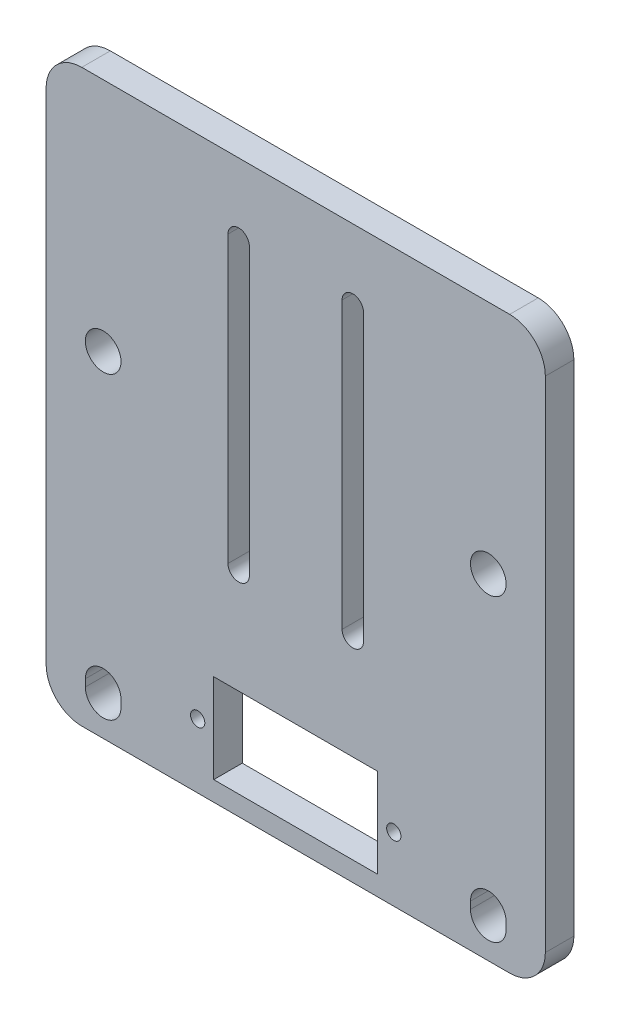
ISO-10303-21;
HEADER;
FILE_DESCRIPTION(('STEP AP214'),'2;1');
FILE_NAME('part.step','',(''),(''),'','','');
FILE_SCHEMA(('AUTOMOTIVE_DESIGN { 1 0 10303 214 1 1 1 1 }'));
ENDSEC;
DATA;
#1=APPLICATION_CONTEXT('core data for automotive mechanical design processes');
#2=APPLICATION_PROTOCOL_DEFINITION('international standard','automotive_design',2000,#1);
#3=PRODUCT_CONTEXT('',#1,'mechanical');
#4=PRODUCT('Part','Part','',(#3));
#5=PRODUCT_RELATED_PRODUCT_CATEGORY('part','',(#4));
#6=PRODUCT_DEFINITION_FORMATION('','',#4);
#7=PRODUCT_DEFINITION_CONTEXT('part definition',#1,'design');
#8=PRODUCT_DEFINITION('design','',#6,#7);
#9=PRODUCT_DEFINITION_SHAPE('','',#8);
#10=(LENGTH_UNIT() NAMED_UNIT(*) SI_UNIT(.MILLI.,.METRE.));
#11=(NAMED_UNIT(*) PLANE_ANGLE_UNIT() SI_UNIT($,.RADIAN.));
#12=(NAMED_UNIT(*) SI_UNIT($,.STERADIAN.) SOLID_ANGLE_UNIT());
#13=UNCERTAINTY_MEASURE_WITH_UNIT(LENGTH_MEASURE(1.E-05),#10,'distance_accuracy_value','');
#14=(GEOMETRIC_REPRESENTATION_CONTEXT(3) GLOBAL_UNCERTAINTY_ASSIGNED_CONTEXT((#13)) GLOBAL_UNIT_ASSIGNED_CONTEXT((#10,
#11,#12)) REPRESENTATION_CONTEXT('',''));
#15=CARTESIAN_POINT('',(0.,0.,0.));
#16=DIRECTION('',(0.,0.,1.));
#17=DIRECTION('',(1.,0.,0.));
#18=AXIS2_PLACEMENT_3D('',#15,#16,#17);
#19=CARTESIAN_POINT('',(0.,0.,4.));
#20=DIRECTION('',(0.,0.,1.));
#21=DIRECTION('',(1.,0.,0.));
#22=AXIS2_PLACEMENT_3D('',#19,#20,#21);
#23=PLANE('',#22);
#24=CARTESIAN_POINT('',(13.75,-31.,4.));
#25=DIRECTION('',(0.,0.,1.));
#26=DIRECTION('',(-1.,0.,0.));
#27=AXIS2_PLACEMENT_3D('',#24,#25,#26);
#28=CIRCLE('',#27,1.);
#29=CARTESIAN_POINT('',(12.75,-31.,4.));
#30=VERTEX_POINT('',#29);
#31=EDGE_CURVE('E247',#30,#30,#28,.T.);
#32=ORIENTED_EDGE('',*,*,#31,.F.);
#33=EDGE_LOOP('',(#32));
#34=FACE_BOUND('',#33,.T.);
#35=CARTESIAN_POINT('',(8.00000000000001,30.,4.));
#36=DIRECTION('',(0.,0.,1.));
#37=DIRECTION('',(-1.,0.,0.));
#38=AXIS2_PLACEMENT_3D('',#35,#36,#37);
#39=CIRCLE('',#38,1.49999999999999);
#40=CARTESIAN_POINT('',(9.5,30.,4.));
#41=VERTEX_POINT('',#40);
#42=CARTESIAN_POINT('',(6.50000000000002,30.,4.));
#43=VERTEX_POINT('',#42);
#44=EDGE_CURVE('E50',#41,#43,#39,.T.);
#45=ORIENTED_EDGE('',*,*,#44,.F.);
#46=DIRECTION('',(0.,1.,0.));
#47=VECTOR('',#46,1.);
#48=CARTESIAN_POINT('',(9.5,30.,4.));
#49=LINE('',#48,#47);
#50=CARTESIAN_POINT('',(9.49999999999999,-10.,4.));
#51=VERTEX_POINT('',#50);
#52=EDGE_CURVE('E269',#51,#41,#49,.T.);
#53=ORIENTED_EDGE('',*,*,#52,.F.);
#54=CARTESIAN_POINT('',(7.99999999999999,-10.,4.));
#55=DIRECTION('',(0.,0.,1.));
#56=DIRECTION('',(-1.,0.,0.));
#57=AXIS2_PLACEMENT_3D('',#54,#55,#56);
#58=CIRCLE('',#57,1.49999999999999);
#59=CARTESIAN_POINT('',(6.5,-10.,4.));
#60=VERTEX_POINT('',#59);
#61=EDGE_CURVE('E284',#60,#51,#58,.T.);
#62=ORIENTED_EDGE('',*,*,#61,.F.);
#63=DIRECTION('',(0.,-1.,0.));
#64=VECTOR('',#63,1.);
#65=CARTESIAN_POINT('',(6.50000000000002,30.,4.));
#66=LINE('',#65,#64);
#67=EDGE_CURVE('E281',#43,#60,#66,.T.);
#68=ORIENTED_EDGE('',*,*,#67,.F.);
#69=EDGE_LOOP('',(#45,#53,#62,#68));
#70=FACE_BOUND('',#69,.T.);
#71=DIRECTION('',(0.,1.,0.));
#72=VECTOR('',#71,1.);
#73=CARTESIAN_POINT('',(11.5,-24.75,4.));
#74=LINE('',#73,#72);
#75=CARTESIAN_POINT('',(11.5,-37.25,4.));
#76=VERTEX_POINT('',#75);
#77=CARTESIAN_POINT('',(11.5,-24.75,4.));
#78=VERTEX_POINT('',#77);
#79=EDGE_CURVE('E58',#76,#78,#74,.T.);
#80=ORIENTED_EDGE('',*,*,#79,.F.);
#81=DIRECTION('',(1.,0.,0.));
#82=VECTOR('',#81,1.);
#83=CARTESIAN_POINT('',(-11.5,-37.25,4.));
#84=LINE('',#83,#82);
#85=CARTESIAN_POINT('',(-11.5,-37.25,4.));
#86=VERTEX_POINT('',#85);
#87=EDGE_CURVE('E241',#86,#76,#84,.T.);
#88=ORIENTED_EDGE('',*,*,#87,.F.);
#89=DIRECTION('',(0.,-1.,0.));
#90=VECTOR('',#89,1.);
#91=CARTESIAN_POINT('',(-11.5,-24.75,4.));
#92=LINE('',#91,#90);
#93=CARTESIAN_POINT('',(-11.5,-24.75,4.));
#94=VERTEX_POINT('',#93);
#95=EDGE_CURVE('E244',#94,#86,#92,.T.);
#96=ORIENTED_EDGE('',*,*,#95,.F.);
#97=DIRECTION('',(-1.,0.,0.));
#98=VECTOR('',#97,1.);
#99=CARTESIAN_POINT('',(-11.5,-24.75,4.));
#100=LINE('',#99,#98);
#101=EDGE_CURVE('E254',#78,#94,#100,.T.);
#102=ORIENTED_EDGE('',*,*,#101,.F.);
#103=EDGE_LOOP('',(#80,#88,#96,#102));
#104=FACE_BOUND('',#103,.T.);
#105=CARTESIAN_POINT('',(-13.75,-31.,4.));
#106=DIRECTION('',(0.,0.,1.));
#107=DIRECTION('',(1.,0.,0.));
#108=AXIS2_PLACEMENT_3D('',#105,#106,#107);
#109=CIRCLE('',#108,1.);
#110=CARTESIAN_POINT('',(-12.75,-31.,4.));
#111=VERTEX_POINT('',#110);
#112=EDGE_CURVE('E261',#111,#111,#109,.T.);
#113=ORIENTED_EDGE('',*,*,#112,.F.);
#114=EDGE_LOOP('',(#113));
#115=FACE_BOUND('',#114,.T.);
#116=CARTESIAN_POINT('',(-8.00000000000001,30.,4.));
#117=DIRECTION('',(0.,0.,1.));
#118=DIRECTION('',(1.,0.,0.));
#119=AXIS2_PLACEMENT_3D('',#116,#117,#118);
#120=CIRCLE('',#119,1.49999999999999);
#121=CARTESIAN_POINT('',(-6.50000000000002,30.,4.));
#122=VERTEX_POINT('',#121);
#123=CARTESIAN_POINT('',(-9.5,30.,4.));
#124=VERTEX_POINT('',#123);
#125=EDGE_CURVE('E309',#122,#124,#120,.T.);
#126=ORIENTED_EDGE('',*,*,#125,.F.);
#127=DIRECTION('',(0.,1.,0.));
#128=VECTOR('',#127,1.);
#129=CARTESIAN_POINT('',(-6.50000000000002,30.,4.));
#130=LINE('',#129,#128);
#131=CARTESIAN_POINT('',(-6.5,-10.,4.));
#132=VERTEX_POINT('',#131);
#133=EDGE_CURVE('E299',#132,#122,#130,.T.);
#134=ORIENTED_EDGE('',*,*,#133,.F.);
#135=CARTESIAN_POINT('',(-7.99999999999999,-10.,4.));
#136=DIRECTION('',(0.,0.,1.));
#137=DIRECTION('',(1.,0.,0.));
#138=AXIS2_PLACEMENT_3D('',#135,#136,#137);
#139=CIRCLE('',#138,1.49999999999999);
#140=CARTESIAN_POINT('',(-9.49999999999999,-10.,4.));
#141=VERTEX_POINT('',#140);
#142=EDGE_CURVE('E316',#141,#132,#139,.T.);
#143=ORIENTED_EDGE('',*,*,#142,.F.);
#144=DIRECTION('',(0.,-1.,0.));
#145=VECTOR('',#144,1.);
#146=CARTESIAN_POINT('',(-9.5,30.,4.));
#147=LINE('',#146,#145);
#148=EDGE_CURVE('E312',#124,#141,#147,.T.);
#149=ORIENTED_EDGE('',*,*,#148,.F.);
#150=EDGE_LOOP('',(#126,#134,#143,#149));
#151=FACE_BOUND('',#150,.T.);
#152=DIRECTION('',(0.,-1.,0.));
#153=VECTOR('',#152,1.);
#154=CARTESIAN_POINT('',(24.5,-34.,4.));
#155=LINE('',#154,#153);
#156=CARTESIAN_POINT('',(24.5,-34.,4.));
#157=VERTEX_POINT('',#156);
#158=CARTESIAN_POINT('',(24.5,-35.,4.));
#159=VERTEX_POINT('',#158);
#160=EDGE_CURVE('E345',#157,#159,#155,.T.);
#161=ORIENTED_EDGE('',*,*,#160,.F.);
#162=CARTESIAN_POINT('',(27.,-34.,4.));
#163=DIRECTION('',(0.,0.,1.));
#164=DIRECTION('',(-1.,0.,0.));
#165=AXIS2_PLACEMENT_3D('',#162,#163,#164);
#166=CIRCLE('',#165,2.5);
#167=CARTESIAN_POINT('',(29.5,-34.,4.));
#168=VERTEX_POINT('',#167);
#169=EDGE_CURVE('E343',#168,#157,#166,.T.);
#170=ORIENTED_EDGE('',*,*,#169,.F.);
#171=DIRECTION('',(0.,1.,0.));
#172=VECTOR('',#171,1.);
#173=CARTESIAN_POINT('',(29.5,-34.,4.));
#174=LINE('',#173,#172);
#175=CARTESIAN_POINT('',(29.5,-35.,4.));
#176=VERTEX_POINT('',#175);
#177=EDGE_CURVE('E352',#176,#168,#174,.T.);
#178=ORIENTED_EDGE('',*,*,#177,.F.);
#179=CARTESIAN_POINT('',(27.,-35.,4.));
#180=DIRECTION('',(0.,0.,1.));
#181=DIRECTION('',(-1.,0.,0.));
#182=AXIS2_PLACEMENT_3D('',#179,#180,#181);
#183=CIRCLE('',#182,2.5);
#184=EDGE_CURVE('E348',#159,#176,#183,.T.);
#185=ORIENTED_EDGE('',*,*,#184,.F.);
#186=EDGE_LOOP('',(#161,#170,#178,#185));
#187=FACE_BOUND('',#186,.T.);
#188=DIRECTION('',(0.,-1.,0.));
#189=VECTOR('',#188,1.);
#190=CARTESIAN_POINT('',(-29.5,-34.,4.));
#191=LINE('',#190,#189);
#192=CARTESIAN_POINT('',(-29.5,-34.,4.));
#193=VERTEX_POINT('',#192);
#194=CARTESIAN_POINT('',(-29.5,-35.,4.));
#195=VERTEX_POINT('',#194);
#196=EDGE_CURVE('E377',#193,#195,#191,.T.);
#197=ORIENTED_EDGE('',*,*,#196,.F.);
#198=CARTESIAN_POINT('',(-27.,-34.,4.));
#199=DIRECTION('',(0.,0.,1.));
#200=DIRECTION('',(1.,0.,0.));
#201=AXIS2_PLACEMENT_3D('',#198,#199,#200);
#202=CIRCLE('',#201,2.5);
#203=CARTESIAN_POINT('',(-24.5,-34.,4.));
#204=VERTEX_POINT('',#203);
#205=EDGE_CURVE('E375',#204,#193,#202,.T.);
#206=ORIENTED_EDGE('',*,*,#205,.F.);
#207=DIRECTION('',(0.,1.,0.));
#208=VECTOR('',#207,1.);
#209=CARTESIAN_POINT('',(-24.5,-34.,4.));
#210=LINE('',#209,#208);
#211=CARTESIAN_POINT('',(-24.5,-35.,4.));
#212=VERTEX_POINT('',#211);
#213=EDGE_CURVE('E384',#212,#204,#210,.T.);
#214=ORIENTED_EDGE('',*,*,#213,.F.);
#215=CARTESIAN_POINT('',(-27.,-35.,4.));
#216=DIRECTION('',(0.,0.,1.));
#217=DIRECTION('',(1.,0.,0.));
#218=AXIS2_PLACEMENT_3D('',#215,#216,#217);
#219=CIRCLE('',#218,2.5);
#220=EDGE_CURVE('E380',#195,#212,#219,.T.);
#221=ORIENTED_EDGE('',*,*,#220,.F.);
#222=EDGE_LOOP('',(#197,#206,#214,#221));
#223=FACE_BOUND('',#222,.T.);
#224=CARTESIAN_POINT('',(-27.,7.,4.));
#225=DIRECTION('',(0.,0.,1.));
#226=DIRECTION('',(1.,0.,0.));
#227=AXIS2_PLACEMENT_3D('',#224,#225,#226);
#228=CIRCLE('',#227,2.5);
#229=CARTESIAN_POINT('',(-24.5,7.,4.));
#230=VERTEX_POINT('',#229);
#231=EDGE_CURVE('E407',#230,#230,#228,.T.);
#232=ORIENTED_EDGE('',*,*,#231,.F.);
#233=EDGE_LOOP('',(#232));
#234=FACE_BOUND('',#233,.T.);
#235=DIRECTION('',(0.,-1.,0.));
#236=VECTOR('',#235,1.);
#237=CARTESIAN_POINT('',(-35.,40.,4.));
#238=LINE('',#237,#236);
#239=CARTESIAN_POINT('',(-35.,35.,4.));
#240=VERTEX_POINT('',#239);
#241=CARTESIAN_POINT('',(-35.,-35.,4.));
#242=VERTEX_POINT('',#241);
#243=EDGE_CURVE('E421',#240,#242,#238,.T.);
#244=ORIENTED_EDGE('',*,*,#243,.T.);
#245=CARTESIAN_POINT('',(-30.,-35.,4.));
#246=DIRECTION('',(0.,0.,1.));
#247=DIRECTION('',(1.,0.,0.));
#248=AXIS2_PLACEMENT_3D('',#245,#246,#247);
#249=CIRCLE('',#248,5.);
#250=CARTESIAN_POINT('',(-30.,-40.,4.));
#251=VERTEX_POINT('',#250);
#252=EDGE_CURVE('E463',#242,#251,#249,.T.);
#253=ORIENTED_EDGE('',*,*,#252,.T.);
#254=DIRECTION('',(1.,0.,0.));
#255=VECTOR('',#254,1.);
#256=CARTESIAN_POINT('',(-35.,-40.,4.));
#257=LINE('',#256,#255);
#258=CARTESIAN_POINT('',(30.,-40.,4.));
#259=VERTEX_POINT('',#258);
#260=EDGE_CURVE('E425',#251,#259,#257,.T.);
#261=ORIENTED_EDGE('',*,*,#260,.T.);
#262=CARTESIAN_POINT('',(30.,-35.,4.));
#263=DIRECTION('',(0.,0.,1.));
#264=DIRECTION('',(1.,0.,0.));
#265=AXIS2_PLACEMENT_3D('',#262,#263,#264);
#266=CIRCLE('',#265,5.);
#267=CARTESIAN_POINT('',(35.,-35.,4.));
#268=VERTEX_POINT('',#267);
#269=EDGE_CURVE('E461',#259,#268,#266,.T.);
#270=ORIENTED_EDGE('',*,*,#269,.T.);
#271=DIRECTION('',(0.,1.,0.));
#272=VECTOR('',#271,1.);
#273=CARTESIAN_POINT('',(35.,40.,4.));
#274=LINE('',#273,#272);
#275=CARTESIAN_POINT('',(35.,35.,4.));
#276=VERTEX_POINT('',#275);
#277=EDGE_CURVE('E414',#268,#276,#274,.T.);
#278=ORIENTED_EDGE('',*,*,#277,.T.);
#279=CARTESIAN_POINT('',(30.,35.,4.));
#280=DIRECTION('',(0.,0.,1.));
#281=DIRECTION('',(1.,0.,0.));
#282=AXIS2_PLACEMENT_3D('',#279,#280,#281);
#283=CIRCLE('',#282,5.);
#284=CARTESIAN_POINT('',(30.,40.,4.));
#285=VERTEX_POINT('',#284);
#286=EDGE_CURVE('E459',#276,#285,#283,.T.);
#287=ORIENTED_EDGE('',*,*,#286,.T.);
#288=DIRECTION('',(-1.,0.,0.));
#289=VECTOR('',#288,1.);
#290=CARTESIAN_POINT('',(-35.,40.,4.));
#291=LINE('',#290,#289);
#292=CARTESIAN_POINT('',(-30.,40.,4.));
#293=VERTEX_POINT('',#292);
#294=EDGE_CURVE('E417',#285,#293,#291,.T.);
#295=ORIENTED_EDGE('',*,*,#294,.T.);
#296=CARTESIAN_POINT('',(-30.,35.,4.));
#297=DIRECTION('',(0.,0.,1.));
#298=DIRECTION('',(1.,0.,0.));
#299=AXIS2_PLACEMENT_3D('',#296,#297,#298);
#300=CIRCLE('',#299,5.);
#301=EDGE_CURVE('E457',#293,#240,#300,.T.);
#302=ORIENTED_EDGE('',*,*,#301,.T.);
#303=EDGE_LOOP('',(#244,#253,#261,#270,#278,#287,#295,#302));
#304=FACE_BOUND('',#303,.T.);
#305=CARTESIAN_POINT('',(27.,7.,4.));
#306=DIRECTION('',(0.,0.,1.));
#307=DIRECTION('',(-1.,0.,0.));
#308=AXIS2_PLACEMENT_3D('',#305,#306,#307);
#309=CIRCLE('',#308,2.5);
#310=CARTESIAN_POINT('',(24.5,7.,4.));
#311=VERTEX_POINT('',#310);
#312=EDGE_CURVE('E334',#311,#311,#309,.T.);
#313=ORIENTED_EDGE('',*,*,#312,.F.);
#314=EDGE_LOOP('',(#313));
#315=FACE_BOUND('',#314,.T.);
#316=ADVANCED_FACE('F35',(#34,#70,#104,#115,#151,#187,#223,#234,#304,#315),#23,.T.);
#317=CARTESIAN_POINT('',(0.,0.,0.));
#318=DIRECTION('',(0.,0.,1.));
#319=DIRECTION('',(1.,0.,0.));
#320=AXIS2_PLACEMENT_3D('',#317,#318,#319);
#321=PLANE('',#320);
#322=CARTESIAN_POINT('',(13.75,-31.,0.));
#323=DIRECTION('',(0.,0.,1.));
#324=DIRECTION('',(-1.,0.,0.));
#325=AXIS2_PLACEMENT_3D('',#322,#323,#324);
#326=CIRCLE('',#325,1.);
#327=CARTESIAN_POINT('',(12.75,-31.,0.));
#328=VERTEX_POINT('',#327);
#329=EDGE_CURVE('E342',#328,#328,#326,.T.);
#330=ORIENTED_EDGE('',*,*,#329,.T.);
#331=EDGE_LOOP('',(#330));
#332=FACE_BOUND('',#331,.T.);
#333=DIRECTION('',(0.,1.,0.));
#334=VECTOR('',#333,1.);
#335=CARTESIAN_POINT('',(9.5,30.,0.));
#336=LINE('',#335,#334);
#337=CARTESIAN_POINT('',(9.49999999999999,-10.,0.));
#338=VERTEX_POINT('',#337);
#339=CARTESIAN_POINT('',(9.5,30.,0.));
#340=VERTEX_POINT('',#339);
#341=EDGE_CURVE('E275',#338,#340,#336,.T.);
#342=ORIENTED_EDGE('',*,*,#341,.T.);
#343=CARTESIAN_POINT('',(8.00000000000001,30.,0.));
#344=DIRECTION('',(0.,0.,1.));
#345=DIRECTION('',(-1.,0.,0.));
#346=AXIS2_PLACEMENT_3D('',#343,#344,#345);
#347=CIRCLE('',#346,1.49999999999999);
#348=CARTESIAN_POINT('',(6.50000000000002,30.,0.));
#349=VERTEX_POINT('',#348);
#350=EDGE_CURVE('E265',#340,#349,#347,.T.);
#351=ORIENTED_EDGE('',*,*,#350,.T.);
#352=DIRECTION('',(0.,-1.,0.));
#353=VECTOR('',#352,1.);
#354=CARTESIAN_POINT('',(6.50000000000002,30.,0.));
#355=LINE('',#354,#353);
#356=CARTESIAN_POINT('',(6.5,-10.,0.));
#357=VERTEX_POINT('',#356);
#358=EDGE_CURVE('E268',#349,#357,#355,.T.);
#359=ORIENTED_EDGE('',*,*,#358,.T.);
#360=CARTESIAN_POINT('',(7.99999999999999,-10.,0.));
#361=DIRECTION('',(0.,0.,1.));
#362=DIRECTION('',(-1.,0.,0.));
#363=AXIS2_PLACEMENT_3D('',#360,#361,#362);
#364=CIRCLE('',#363,1.49999999999999);
#365=EDGE_CURVE('E272',#357,#338,#364,.T.);
#366=ORIENTED_EDGE('',*,*,#365,.T.);
#367=EDGE_LOOP('',(#342,#351,#359,#366));
#368=FACE_BOUND('',#367,.T.);
#369=DIRECTION('',(1.,0.,0.));
#370=VECTOR('',#369,1.);
#371=CARTESIAN_POINT('',(-11.5,-37.25,0.));
#372=LINE('',#371,#370);
#373=CARTESIAN_POINT('',(-11.5,-37.25,0.));
#374=VERTEX_POINT('',#373);
#375=CARTESIAN_POINT('',(11.5,-37.25,0.));
#376=VERTEX_POINT('',#375);
#377=EDGE_CURVE('E228',#374,#376,#372,.T.);
#378=ORIENTED_EDGE('',*,*,#377,.T.);
#379=DIRECTION('',(0.,1.,0.));
#380=VECTOR('',#379,1.);
#381=CARTESIAN_POINT('',(11.5,-24.75,0.));
#382=LINE('',#381,#380);
#383=CARTESIAN_POINT('',(11.5,-24.75,0.));
#384=VERTEX_POINT('',#383);
#385=EDGE_CURVE('E222',#376,#384,#382,.T.);
#386=ORIENTED_EDGE('',*,*,#385,.T.);
#387=DIRECTION('',(-1.,0.,0.));
#388=VECTOR('',#387,1.);
#389=CARTESIAN_POINT('',(-11.5,-24.75,0.));
#390=LINE('',#389,#388);
#391=CARTESIAN_POINT('',(-11.5,-24.75,0.));
#392=VERTEX_POINT('',#391);
#393=EDGE_CURVE('E232',#384,#392,#390,.T.);
#394=ORIENTED_EDGE('',*,*,#393,.T.);
#395=DIRECTION('',(0.,-1.,0.));
#396=VECTOR('',#395,1.);
#397=CARTESIAN_POINT('',(-11.5,-24.75,0.));
#398=LINE('',#397,#396);
#399=EDGE_CURVE('E236',#392,#374,#398,.T.);
#400=ORIENTED_EDGE('',*,*,#399,.T.);
#401=EDGE_LOOP('',(#378,#386,#394,#400));
#402=FACE_BOUND('',#401,.T.);
#403=CARTESIAN_POINT('',(-13.75,-31.,0.));
#404=DIRECTION('',(0.,0.,1.));
#405=DIRECTION('',(1.,0.,0.));
#406=AXIS2_PLACEMENT_3D('',#403,#404,#405);
#407=CIRCLE('',#406,1.);
#408=CARTESIAN_POINT('',(-12.75,-31.,0.));
#409=VERTEX_POINT('',#408);
#410=EDGE_CURVE('E313',#409,#409,#407,.T.);
#411=ORIENTED_EDGE('',*,*,#410,.T.);
#412=EDGE_LOOP('',(#411));
#413=FACE_BOUND('',#412,.T.);
#414=DIRECTION('',(0.,1.,0.));
#415=VECTOR('',#414,1.);
#416=CARTESIAN_POINT('',(-6.50000000000002,30.,0.));
#417=LINE('',#416,#415);
#418=CARTESIAN_POINT('',(-6.5,-10.,0.));
#419=VERTEX_POINT('',#418);
#420=CARTESIAN_POINT('',(-6.50000000000002,30.,0.));
#421=VERTEX_POINT('',#420);
#422=EDGE_CURVE('E305',#419,#421,#417,.T.);
#423=ORIENTED_EDGE('',*,*,#422,.T.);
#424=CARTESIAN_POINT('',(-8.00000000000001,30.,0.));
#425=DIRECTION('',(0.,0.,1.));
#426=DIRECTION('',(1.,0.,0.));
#427=AXIS2_PLACEMENT_3D('',#424,#425,#426);
#428=CIRCLE('',#427,1.49999999999999);
#429=CARTESIAN_POINT('',(-9.5,30.,0.));
#430=VERTEX_POINT('',#429);
#431=EDGE_CURVE('E295',#421,#430,#428,.T.);
#432=ORIENTED_EDGE('',*,*,#431,.T.);
#433=DIRECTION('',(0.,-1.,0.));
#434=VECTOR('',#433,1.);
#435=CARTESIAN_POINT('',(-9.5,30.,0.));
#436=LINE('',#435,#434);
#437=CARTESIAN_POINT('',(-9.49999999999999,-10.,0.));
#438=VERTEX_POINT('',#437);
#439=EDGE_CURVE('E298',#430,#438,#436,.T.);
#440=ORIENTED_EDGE('',*,*,#439,.T.);
#441=CARTESIAN_POINT('',(-7.99999999999999,-10.,0.));
#442=DIRECTION('',(0.,0.,1.));
#443=DIRECTION('',(1.,0.,0.));
#444=AXIS2_PLACEMENT_3D('',#441,#442,#443);
#445=CIRCLE('',#444,1.49999999999999);
#446=EDGE_CURVE('E302',#438,#419,#445,.T.);
#447=ORIENTED_EDGE('',*,*,#446,.T.);
#448=EDGE_LOOP('',(#423,#432,#440,#447));
#449=FACE_BOUND('',#448,.T.);
#450=CARTESIAN_POINT('',(-27.,-34.,0.));
#451=DIRECTION('',(0.,0.,1.));
#452=DIRECTION('',(1.,0.,0.));
#453=AXIS2_PLACEMENT_3D('',#450,#451,#452);
#454=CIRCLE('',#453,2.5);
#455=CARTESIAN_POINT('',(-24.5,-34.,0.));
#456=VERTEX_POINT('',#455);
#457=CARTESIAN_POINT('',(-29.5,-34.,0.));
#458=VERTEX_POINT('',#457);
#459=EDGE_CURVE('E374',#456,#458,#454,.T.);
#460=ORIENTED_EDGE('',*,*,#459,.T.);
#461=DIRECTION('',(0.,-1.,0.));
#462=VECTOR('',#461,1.);
#463=CARTESIAN_POINT('',(-29.5,-34.,0.));
#464=LINE('',#463,#462);
#465=CARTESIAN_POINT('',(-29.5,-35.,0.));
#466=VERTEX_POINT('',#465);
#467=EDGE_CURVE('E389',#458,#466,#464,.T.);
#468=ORIENTED_EDGE('',*,*,#467,.T.);
#469=CARTESIAN_POINT('',(-27.,-35.,0.));
#470=DIRECTION('',(0.,0.,1.));
#471=DIRECTION('',(1.,0.,0.));
#472=AXIS2_PLACEMENT_3D('',#469,#470,#471);
#473=CIRCLE('',#472,2.5);
#474=CARTESIAN_POINT('',(-24.5,-35.,0.));
#475=VERTEX_POINT('',#474);
#476=EDGE_CURVE('E392',#466,#475,#473,.T.);
#477=ORIENTED_EDGE('',*,*,#476,.T.);
#478=DIRECTION('',(0.,1.,0.));
#479=VECTOR('',#478,1.);
#480=CARTESIAN_POINT('',(-24.5,-34.,0.));
#481=LINE('',#480,#479);
#482=EDGE_CURVE('E378',#475,#456,#481,.T.);
#483=ORIENTED_EDGE('',*,*,#482,.T.);
#484=EDGE_LOOP('',(#460,#468,#477,#483));
#485=FACE_BOUND('',#484,.T.);
#486=DIRECTION('',(1.,0.,0.));
#487=VECTOR('',#486,1.);
#488=CARTESIAN_POINT('',(-35.,-40.,0.));
#489=LINE('',#488,#487);
#490=CARTESIAN_POINT('',(-30.,-40.,0.));
#491=VERTEX_POINT('',#490);
#492=CARTESIAN_POINT('',(30.,-40.,0.));
#493=VERTEX_POINT('',#492);
#494=EDGE_CURVE('E418',#491,#493,#489,.T.);
#495=ORIENTED_EDGE('',*,*,#494,.F.);
#496=CARTESIAN_POINT('',(-30.,-35.,0.));
#497=DIRECTION('',(0.,0.,1.));
#498=DIRECTION('',(1.,0.,0.));
#499=AXIS2_PLACEMENT_3D('',#496,#497,#498);
#500=CIRCLE('',#499,5.);
#501=CARTESIAN_POINT('',(-35.,-35.,0.));
#502=VERTEX_POINT('',#501);
#503=EDGE_CURVE('E450',#491,#502,#500,.F.);
#504=ORIENTED_EDGE('',*,*,#503,.T.);
#505=DIRECTION('',(0.,-1.,0.));
#506=VECTOR('',#505,1.);
#507=CARTESIAN_POINT('',(-35.,40.,0.));
#508=LINE('',#507,#506);
#509=CARTESIAN_POINT('',(-35.,35.,0.));
#510=VERTEX_POINT('',#509);
#511=EDGE_CURVE('E435',#510,#502,#508,.T.);
#512=ORIENTED_EDGE('',*,*,#511,.F.);
#513=CARTESIAN_POINT('',(-30.,35.,0.));
#514=DIRECTION('',(0.,0.,1.));
#515=DIRECTION('',(1.,0.,0.));
#516=AXIS2_PLACEMENT_3D('',#513,#514,#515);
#517=CIRCLE('',#516,5.);
#518=CARTESIAN_POINT('',(-30.,40.,0.));
#519=VERTEX_POINT('',#518);
#520=EDGE_CURVE('E444',#510,#519,#517,.F.);
#521=ORIENTED_EDGE('',*,*,#520,.T.);
#522=DIRECTION('',(-1.,0.,0.));
#523=VECTOR('',#522,1.);
#524=CARTESIAN_POINT('',(-35.,40.,0.));
#525=LINE('',#524,#523);
#526=CARTESIAN_POINT('',(30.,40.,0.));
#527=VERTEX_POINT('',#526);
#528=EDGE_CURVE('E432',#527,#519,#525,.T.);
#529=ORIENTED_EDGE('',*,*,#528,.F.);
#530=CARTESIAN_POINT('',(30.,35.,0.));
#531=DIRECTION('',(0.,0.,1.));
#532=DIRECTION('',(1.,0.,0.));
#533=AXIS2_PLACEMENT_3D('',#530,#531,#532);
#534=CIRCLE('',#533,5.);
#535=CARTESIAN_POINT('',(35.,35.,0.));
#536=VERTEX_POINT('',#535);
#537=EDGE_CURVE('E446',#527,#536,#534,.F.);
#538=ORIENTED_EDGE('',*,*,#537,.T.);
#539=DIRECTION('',(0.,1.,0.));
#540=VECTOR('',#539,1.);
#541=CARTESIAN_POINT('',(35.,40.,0.));
#542=LINE('',#541,#540);
#543=CARTESIAN_POINT('',(35.,-35.,0.));
#544=VERTEX_POINT('',#543);
#545=EDGE_CURVE('E411',#544,#536,#542,.T.);
#546=ORIENTED_EDGE('',*,*,#545,.F.);
#547=CARTESIAN_POINT('',(30.,-35.,0.));
#548=DIRECTION('',(0.,0.,1.));
#549=DIRECTION('',(1.,0.,0.));
#550=AXIS2_PLACEMENT_3D('',#547,#548,#549);
#551=CIRCLE('',#550,5.);
#552=EDGE_CURVE('E448',#544,#493,#551,.F.);
#553=ORIENTED_EDGE('',*,*,#552,.T.);
#554=EDGE_LOOP('',(#495,#504,#512,#521,#529,#538,#546,#553));
#555=FACE_BOUND('',#554,.T.);
#556=CARTESIAN_POINT('',(-27.,7.,0.));
#557=DIRECTION('',(0.,0.,1.));
#558=DIRECTION('',(1.,0.,0.));
#559=AXIS2_PLACEMENT_3D('',#556,#557,#558);
#560=CIRCLE('',#559,2.5);
#561=CARTESIAN_POINT('',(-24.5,7.,0.));
#562=VERTEX_POINT('',#561);
#563=EDGE_CURVE('E406',#562,#562,#560,.T.);
#564=ORIENTED_EDGE('',*,*,#563,.T.);
#565=EDGE_LOOP('',(#564));
#566=FACE_BOUND('',#565,.T.);
#567=CARTESIAN_POINT('',(27.,-34.,0.));
#568=DIRECTION('',(0.,0.,1.));
#569=DIRECTION('',(-1.,0.,0.));
#570=AXIS2_PLACEMENT_3D('',#567,#568,#569);
#571=CIRCLE('',#570,2.5);
#572=CARTESIAN_POINT('',(29.5,-34.,0.));
#573=VERTEX_POINT('',#572);
#574=CARTESIAN_POINT('',(24.5,-34.,0.));
#575=VERTEX_POINT('',#574);
#576=EDGE_CURVE('E338',#573,#575,#571,.T.);
#577=ORIENTED_EDGE('',*,*,#576,.T.);
#578=DIRECTION('',(0.,-1.,0.));
#579=VECTOR('',#578,1.);
#580=CARTESIAN_POINT('',(24.5,-34.,0.));
#581=LINE('',#580,#579);
#582=CARTESIAN_POINT('',(24.5,-35.,0.));
#583=VERTEX_POINT('',#582);
#584=EDGE_CURVE('E357',#575,#583,#581,.T.);
#585=ORIENTED_EDGE('',*,*,#584,.T.);
#586=CARTESIAN_POINT('',(27.,-35.,0.));
#587=DIRECTION('',(0.,0.,1.));
#588=DIRECTION('',(-1.,0.,0.));
#589=AXIS2_PLACEMENT_3D('',#586,#587,#588);
#590=CIRCLE('',#589,2.5);
#591=CARTESIAN_POINT('',(29.5,-35.,0.));
#592=VERTEX_POINT('',#591);
#593=EDGE_CURVE('E360',#583,#592,#590,.T.);
#594=ORIENTED_EDGE('',*,*,#593,.T.);
#595=DIRECTION('',(0.,1.,0.));
#596=VECTOR('',#595,1.);
#597=CARTESIAN_POINT('',(29.5,-34.,0.));
#598=LINE('',#597,#596);
#599=EDGE_CURVE('E346',#592,#573,#598,.T.);
#600=ORIENTED_EDGE('',*,*,#599,.T.);
#601=EDGE_LOOP('',(#577,#585,#594,#600));
#602=FACE_BOUND('',#601,.T.);
#603=CARTESIAN_POINT('',(27.,7.,0.));
#604=DIRECTION('',(0.,0.,1.));
#605=DIRECTION('',(-1.,0.,0.));
#606=AXIS2_PLACEMENT_3D('',#603,#604,#605);
#607=CIRCLE('',#606,2.5);
#608=CARTESIAN_POINT('',(24.5,7.,0.));
#609=VERTEX_POINT('',#608);
#610=EDGE_CURVE('E339',#609,#609,#607,.T.);
#611=ORIENTED_EDGE('',*,*,#610,.T.);
#612=EDGE_LOOP('',(#611));
#613=FACE_BOUND('',#612,.T.);
#614=ADVANCED_FACE('F238',(#332,#368,#402,#413,#449,#485,#555,#566,#602,#613),#321,.F.);
#615=CARTESIAN_POINT('',(35.,40.,4.));
#616=DIRECTION('',(-1.,0.,0.));
#617=DIRECTION('',(0.,-1.,0.));
#618=AXIS2_PLACEMENT_3D('',#615,#616,#617);
#619=PLANE('',#618);
#620=ORIENTED_EDGE('',*,*,#277,.F.);
#621=DIRECTION('',(0.,0.,-1.));
#622=VECTOR('',#621,1.);
#623=CARTESIAN_POINT('',(35.,-35.,4.));
#624=LINE('',#623,#622);
#625=EDGE_CURVE('E467',#268,#544,#624,.T.);
#626=ORIENTED_EDGE('',*,*,#625,.T.);
#627=ORIENTED_EDGE('',*,*,#545,.T.);
#628=DIRECTION('',(0.,0.,-1.));
#629=VECTOR('',#628,1.);
#630=CARTESIAN_POINT('',(35.,35.,4.));
#631=LINE('',#630,#629);
#632=EDGE_CURVE('E465',#536,#276,#631,.F.);
#633=ORIENTED_EDGE('',*,*,#632,.T.);
#634=EDGE_LOOP('',(#620,#626,#627,#633));
#635=FACE_BOUND('',#634,.T.);
#636=ADVANCED_FACE('F504',(#635),#619,.F.);
#637=CARTESIAN_POINT('',(-35.,40.,4.));
#638=DIRECTION('',(0.,-1.,0.));
#639=DIRECTION('',(0.,0.,-1.));
#640=AXIS2_PLACEMENT_3D('',#637,#638,#639);
#641=PLANE('',#640);
#642=ORIENTED_EDGE('',*,*,#294,.F.);
#643=DIRECTION('',(0.,0.,-1.));
#644=VECTOR('',#643,1.);
#645=CARTESIAN_POINT('',(30.,40.,4.));
#646=LINE('',#645,#644);
#647=EDGE_CURVE('E11',#285,#527,#646,.T.);
#648=ORIENTED_EDGE('',*,*,#647,.T.);
#649=ORIENTED_EDGE('',*,*,#528,.T.);
#650=DIRECTION('',(0.,0.,-1.));
#651=VECTOR('',#650,1.);
#652=CARTESIAN_POINT('',(-30.,40.,4.));
#653=LINE('',#652,#651);
#654=EDGE_CURVE('E43',#519,#293,#653,.F.);
#655=ORIENTED_EDGE('',*,*,#654,.T.);
#656=EDGE_LOOP('',(#642,#648,#649,#655));
#657=FACE_BOUND('',#656,.T.);
#658=ADVANCED_FACE('F472',(#657),#641,.F.);
#659=CARTESIAN_POINT('',(-35.,40.,4.));
#660=DIRECTION('',(1.,0.,0.));
#661=DIRECTION('',(0.,0.,-1.));
#662=AXIS2_PLACEMENT_3D('',#659,#660,#661);
#663=PLANE('',#662);
#664=ORIENTED_EDGE('',*,*,#511,.T.);
#665=DIRECTION('',(0.,0.,-1.));
#666=VECTOR('',#665,1.);
#667=CARTESIAN_POINT('',(-35.,-35.,4.));
#668=LINE('',#667,#666);
#669=EDGE_CURVE('E455',#502,#242,#668,.F.);
#670=ORIENTED_EDGE('',*,*,#669,.T.);
#671=ORIENTED_EDGE('',*,*,#243,.F.);
#672=DIRECTION('',(0.,0.,-1.));
#673=VECTOR('',#672,1.);
#674=CARTESIAN_POINT('',(-35.,35.,4.));
#675=LINE('',#674,#673);
#676=EDGE_CURVE('E452',#240,#510,#675,.T.);
#677=ORIENTED_EDGE('',*,*,#676,.T.);
#678=EDGE_LOOP('',(#664,#670,#671,#677));
#679=FACE_BOUND('',#678,.T.);
#680=ADVANCED_FACE('F484',(#679),#663,.F.);
#681=CARTESIAN_POINT('',(-35.,-40.,4.));
#682=DIRECTION('',(0.,1.,0.));
#683=DIRECTION('',(0.,0.,1.));
#684=AXIS2_PLACEMENT_3D('',#681,#682,#683);
#685=PLANE('',#684);
#686=ORIENTED_EDGE('',*,*,#260,.F.);
#687=DIRECTION('',(0.,0.,-1.));
#688=VECTOR('',#687,1.);
#689=CARTESIAN_POINT('',(-30.,-40.,4.));
#690=LINE('',#689,#688);
#691=EDGE_CURVE('E441',#251,#491,#690,.T.);
#692=ORIENTED_EDGE('',*,*,#691,.T.);
#693=ORIENTED_EDGE('',*,*,#494,.T.);
#694=DIRECTION('',(0.,0.,-1.));
#695=VECTOR('',#694,1.);
#696=CARTESIAN_POINT('',(30.,-40.,4.));
#697=LINE('',#696,#695);
#698=EDGE_CURVE('E429',#493,#259,#697,.F.);
#699=ORIENTED_EDGE('',*,*,#698,.T.);
#700=EDGE_LOOP('',(#686,#692,#693,#699));
#701=FACE_BOUND('',#700,.T.);
#702=ADVANCED_FACE('F495',(#701),#685,.F.);
#703=CARTESIAN_POINT('',(-27.,7.,4.));
#704=DIRECTION('',(0.,0.,-1.));
#705=DIRECTION('',(-1.,0.,0.));
#706=AXIS2_PLACEMENT_3D('',#703,#704,#705);
#707=CYLINDRICAL_SURFACE('',#706,2.5);
#708=ORIENTED_EDGE('',*,*,#231,.T.);
#709=EDGE_LOOP('',(#708));
#710=FACE_BOUND('',#709,.T.);
#711=ORIENTED_EDGE('',*,*,#563,.F.);
#712=EDGE_LOOP('',(#711));
#713=FACE_BOUND('',#712,.T.);
#714=ADVANCED_FACE('F526',(#710,#713),#707,.F.);
#715=CARTESIAN_POINT('',(-27.,-34.,4.));
#716=DIRECTION('',(0.,0.,-1.));
#717=DIRECTION('',(-1.,0.,0.));
#718=AXIS2_PLACEMENT_3D('',#715,#716,#717);
#719=CYLINDRICAL_SURFACE('',#718,2.5);
#720=ORIENTED_EDGE('',*,*,#459,.F.);
#721=DIRECTION('',(0.,0.,-1.));
#722=VECTOR('',#721,1.);
#723=CARTESIAN_POINT('',(-24.5,-34.,4.));
#724=LINE('',#723,#722);
#725=EDGE_CURVE('E386',#204,#456,#724,.T.);
#726=ORIENTED_EDGE('',*,*,#725,.F.);
#727=ORIENTED_EDGE('',*,*,#205,.T.);
#728=DIRECTION('',(0.,0.,-1.));
#729=VECTOR('',#728,1.);
#730=CARTESIAN_POINT('',(-29.5,-34.,4.));
#731=LINE('',#730,#729);
#732=EDGE_CURVE('E403',#193,#458,#731,.T.);
#733=ORIENTED_EDGE('',*,*,#732,.T.);
#734=EDGE_LOOP('',(#720,#726,#727,#733));
#735=FACE_BOUND('',#734,.T.);
#736=ADVANCED_FACE('F577',(#735),#719,.F.);
#737=CARTESIAN_POINT('',(-29.5,-34.,4.));
#738=DIRECTION('',(1.,0.,0.));
#739=DIRECTION('',(0.,0.,-1.));
#740=AXIS2_PLACEMENT_3D('',#737,#738,#739);
#741=PLANE('',#740);
#742=ORIENTED_EDGE('',*,*,#467,.F.);
#743=ORIENTED_EDGE('',*,*,#732,.F.);
#744=ORIENTED_EDGE('',*,*,#196,.T.);
#745=DIRECTION('',(0.,0.,-1.));
#746=VECTOR('',#745,1.);
#747=CARTESIAN_POINT('',(-29.5,-35.,4.));
#748=LINE('',#747,#746);
#749=EDGE_CURVE('E401',#195,#466,#748,.T.);
#750=ORIENTED_EDGE('',*,*,#749,.T.);
#751=EDGE_LOOP('',(#742,#743,#744,#750));
#752=FACE_BOUND('',#751,.T.);
#753=ADVANCED_FACE('F574',(#752),#741,.T.);
#754=CARTESIAN_POINT('',(-27.,-35.,4.));
#755=DIRECTION('',(0.,0.,-1.));
#756=DIRECTION('',(-1.,0.,0.));
#757=AXIS2_PLACEMENT_3D('',#754,#755,#756);
#758=CYLINDRICAL_SURFACE('',#757,2.5);
#759=ORIENTED_EDGE('',*,*,#476,.F.);
#760=ORIENTED_EDGE('',*,*,#749,.F.);
#761=ORIENTED_EDGE('',*,*,#220,.T.);
#762=DIRECTION('',(0.,0.,-1.));
#763=VECTOR('',#762,1.);
#764=CARTESIAN_POINT('',(-24.5,-35.,4.));
#765=LINE('',#764,#763);
#766=EDGE_CURVE('E399',#212,#475,#765,.T.);
#767=ORIENTED_EDGE('',*,*,#766,.T.);
#768=EDGE_LOOP('',(#759,#760,#761,#767));
#769=FACE_BOUND('',#768,.T.);
#770=ADVANCED_FACE('F570',(#769),#758,.F.);
#771=CARTESIAN_POINT('',(-24.5,-34.,4.));
#772=DIRECTION('',(-1.,0.,0.));
#773=DIRECTION('',(0.,0.,1.));
#774=AXIS2_PLACEMENT_3D('',#771,#772,#773);
#775=PLANE('',#774);
#776=ORIENTED_EDGE('',*,*,#482,.F.);
#777=ORIENTED_EDGE('',*,*,#766,.F.);
#778=ORIENTED_EDGE('',*,*,#213,.T.);
#779=ORIENTED_EDGE('',*,*,#725,.T.);
#780=EDGE_LOOP('',(#776,#777,#778,#779));
#781=FACE_BOUND('',#780,.T.);
#782=ADVANCED_FACE('F566',(#781),#775,.T.);
#783=CARTESIAN_POINT('',(27.,-34.,4.));
#784=DIRECTION('',(0.,0.,-1.));
#785=DIRECTION('',(-1.,0.,0.));
#786=AXIS2_PLACEMENT_3D('',#783,#784,#785);
#787=CYLINDRICAL_SURFACE('',#786,2.5);
#788=ORIENTED_EDGE('',*,*,#576,.F.);
#789=DIRECTION('',(0.,0.,-1.));
#790=VECTOR('',#789,1.);
#791=CARTESIAN_POINT('',(29.5,-34.,4.));
#792=LINE('',#791,#790);
#793=EDGE_CURVE('E354',#168,#573,#792,.T.);
#794=ORIENTED_EDGE('',*,*,#793,.F.);
#795=ORIENTED_EDGE('',*,*,#169,.T.);
#796=DIRECTION('',(0.,0.,-1.));
#797=VECTOR('',#796,1.);
#798=CARTESIAN_POINT('',(24.5,-34.,4.));
#799=LINE('',#798,#797);
#800=EDGE_CURVE('E371',#157,#575,#799,.T.);
#801=ORIENTED_EDGE('',*,*,#800,.T.);
#802=EDGE_LOOP('',(#788,#794,#795,#801));
#803=FACE_BOUND('',#802,.T.);
#804=ADVANCED_FACE('F562',(#803),#787,.F.);
#805=CARTESIAN_POINT('',(24.5,-34.,4.));
#806=DIRECTION('',(1.,0.,0.));
#807=DIRECTION('',(0.,0.,-1.));
#808=AXIS2_PLACEMENT_3D('',#805,#806,#807);
#809=PLANE('',#808);
#810=ORIENTED_EDGE('',*,*,#584,.F.);
#811=ORIENTED_EDGE('',*,*,#800,.F.);
#812=ORIENTED_EDGE('',*,*,#160,.T.);
#813=DIRECTION('',(0.,0.,-1.));
#814=VECTOR('',#813,1.);
#815=CARTESIAN_POINT('',(24.5,-35.,4.));
#816=LINE('',#815,#814);
#817=EDGE_CURVE('E369',#159,#583,#816,.T.);
#818=ORIENTED_EDGE('',*,*,#817,.T.);
#819=EDGE_LOOP('',(#810,#811,#812,#818));
#820=FACE_BOUND('',#819,.T.);
#821=ADVANCED_FACE('F558',(#820),#809,.T.);
#822=CARTESIAN_POINT('',(27.,-35.,4.));
#823=DIRECTION('',(0.,0.,-1.));
#824=DIRECTION('',(-1.,0.,0.));
#825=AXIS2_PLACEMENT_3D('',#822,#823,#824);
#826=CYLINDRICAL_SURFACE('',#825,2.5);
#827=ORIENTED_EDGE('',*,*,#593,.F.);
#828=ORIENTED_EDGE('',*,*,#817,.F.);
#829=ORIENTED_EDGE('',*,*,#184,.T.);
#830=DIRECTION('',(0.,0.,-1.));
#831=VECTOR('',#830,1.);
#832=CARTESIAN_POINT('',(29.5,-35.,4.));
#833=LINE('',#832,#831);
#834=EDGE_CURVE('E367',#176,#592,#833,.T.);
#835=ORIENTED_EDGE('',*,*,#834,.T.);
#836=EDGE_LOOP('',(#827,#828,#829,#835));
#837=FACE_BOUND('',#836,.T.);
#838=ADVANCED_FACE('F548',(#837),#826,.F.);
#839=CARTESIAN_POINT('',(29.5,-34.,4.));
#840=DIRECTION('',(-1.,0.,0.));
#841=DIRECTION('',(0.,0.,1.));
#842=AXIS2_PLACEMENT_3D('',#839,#840,#841);
#843=PLANE('',#842);
#844=ORIENTED_EDGE('',*,*,#599,.F.);
#845=ORIENTED_EDGE('',*,*,#834,.F.);
#846=ORIENTED_EDGE('',*,*,#177,.T.);
#847=ORIENTED_EDGE('',*,*,#793,.T.);
#848=EDGE_LOOP('',(#844,#845,#846,#847));
#849=FACE_BOUND('',#848,.T.);
#850=ADVANCED_FACE('F542',(#849),#843,.T.);
#851=CARTESIAN_POINT('',(27.,7.,4.));
#852=DIRECTION('',(0.,0.,-1.));
#853=DIRECTION('',(-1.,0.,0.));
#854=AXIS2_PLACEMENT_3D('',#851,#852,#853);
#855=CYLINDRICAL_SURFACE('',#854,2.5);
#856=ORIENTED_EDGE('',*,*,#312,.T.);
#857=EDGE_LOOP('',(#856));
#858=FACE_BOUND('',#857,.T.);
#859=ORIENTED_EDGE('',*,*,#610,.F.);
#860=EDGE_LOOP('',(#859));
#861=FACE_BOUND('',#860,.T.);
#862=ADVANCED_FACE('F538',(#858,#861),#855,.F.);
#863=CARTESIAN_POINT('',(-30.,-35.,4.));
#864=DIRECTION('',(0.,0.,-1.));
#865=DIRECTION('',(-1.,0.,0.));
#866=AXIS2_PLACEMENT_3D('',#863,#864,#865);
#867=CYLINDRICAL_SURFACE('',#866,5.);
#868=ORIENTED_EDGE('',*,*,#252,.F.);
#869=ORIENTED_EDGE('',*,*,#669,.F.);
#870=ORIENTED_EDGE('',*,*,#503,.F.);
#871=ORIENTED_EDGE('',*,*,#691,.F.);
#872=EDGE_LOOP('',(#868,#869,#870,#871));
#873=FACE_BOUND('',#872,.T.);
#874=ADVANCED_FACE('F492',(#873),#867,.T.);
#875=CARTESIAN_POINT('',(30.,-35.,4.));
#876=DIRECTION('',(0.,0.,-1.));
#877=DIRECTION('',(-1.,0.,0.));
#878=AXIS2_PLACEMENT_3D('',#875,#876,#877);
#879=CYLINDRICAL_SURFACE('',#878,5.);
#880=ORIENTED_EDGE('',*,*,#269,.F.);
#881=ORIENTED_EDGE('',*,*,#698,.F.);
#882=ORIENTED_EDGE('',*,*,#552,.F.);
#883=ORIENTED_EDGE('',*,*,#625,.F.);
#884=EDGE_LOOP('',(#880,#881,#882,#883));
#885=FACE_BOUND('',#884,.T.);
#886=ADVANCED_FACE('F501',(#885),#879,.T.);
#887=CARTESIAN_POINT('',(30.,35.,4.));
#888=DIRECTION('',(0.,0.,-1.));
#889=DIRECTION('',(-1.,0.,0.));
#890=AXIS2_PLACEMENT_3D('',#887,#888,#889);
#891=CYLINDRICAL_SURFACE('',#890,5.);
#892=ORIENTED_EDGE('',*,*,#286,.F.);
#893=ORIENTED_EDGE('',*,*,#632,.F.);
#894=ORIENTED_EDGE('',*,*,#537,.F.);
#895=ORIENTED_EDGE('',*,*,#647,.F.);
#896=EDGE_LOOP('',(#892,#893,#894,#895));
#897=FACE_BOUND('',#896,.T.);
#898=ADVANCED_FACE('F507',(#897),#891,.T.);
#899=CARTESIAN_POINT('',(-30.,35.,4.));
#900=DIRECTION('',(0.,0.,-1.));
#901=DIRECTION('',(-1.,0.,0.));
#902=AXIS2_PLACEMENT_3D('',#899,#900,#901);
#903=CYLINDRICAL_SURFACE('',#902,5.);
#904=ORIENTED_EDGE('',*,*,#301,.F.);
#905=ORIENTED_EDGE('',*,*,#654,.F.);
#906=ORIENTED_EDGE('',*,*,#520,.F.);
#907=ORIENTED_EDGE('',*,*,#676,.F.);
#908=EDGE_LOOP('',(#904,#905,#906,#907));
#909=FACE_BOUND('',#908,.T.);
#910=ADVANCED_FACE('F37',(#909),#903,.T.);
#911=CARTESIAN_POINT('',(-8.00000000000001,30.,0.));
#912=DIRECTION('',(0.,0.,1.));
#913=DIRECTION('',(1.,0.,0.));
#914=AXIS2_PLACEMENT_3D('',#911,#912,#913);
#915=CYLINDRICAL_SURFACE('',#914,1.49999999999999);
#916=ORIENTED_EDGE('',*,*,#125,.T.);
#917=DIRECTION('',(0.,0.,1.));
#918=VECTOR('',#917,1.);
#919=CARTESIAN_POINT('',(-9.5,30.,0.));
#920=LINE('',#919,#918);
#921=EDGE_CURVE('E308',#430,#124,#920,.T.);
#922=ORIENTED_EDGE('',*,*,#921,.F.);
#923=ORIENTED_EDGE('',*,*,#431,.F.);
#924=DIRECTION('',(0.,0.,1.));
#925=VECTOR('',#924,1.);
#926=CARTESIAN_POINT('',(-6.50000000000002,30.,0.));
#927=LINE('',#926,#925);
#928=EDGE_CURVE('E321',#421,#122,#927,.T.);
#929=ORIENTED_EDGE('',*,*,#928,.T.);
#930=EDGE_LOOP('',(#916,#922,#923,#929));
#931=FACE_BOUND('',#930,.T.);
#932=ADVANCED_FACE('F513',(#931),#915,.F.);
#933=CARTESIAN_POINT('',(-6.50000000000002,30.,0.));
#934=DIRECTION('',(1.,0.,0.));
#935=DIRECTION('',(0.,1.,0.));
#936=AXIS2_PLACEMENT_3D('',#933,#934,#935);
#937=PLANE('',#936);
#938=ORIENTED_EDGE('',*,*,#133,.T.);
#939=ORIENTED_EDGE('',*,*,#928,.F.);
#940=ORIENTED_EDGE('',*,*,#422,.F.);
#941=DIRECTION('',(0.,0.,1.));
#942=VECTOR('',#941,1.);
#943=CARTESIAN_POINT('',(-6.5,-10.,0.));
#944=LINE('',#943,#942);
#945=EDGE_CURVE('E323',#419,#132,#944,.T.);
#946=ORIENTED_EDGE('',*,*,#945,.T.);
#947=EDGE_LOOP('',(#938,#939,#940,#946));
#948=FACE_BOUND('',#947,.T.);
#949=ADVANCED_FACE('F703',(#948),#937,.F.);
#950=CARTESIAN_POINT('',(-7.99999999999999,-10.,0.));
#951=DIRECTION('',(0.,0.,1.));
#952=DIRECTION('',(1.,0.,0.));
#953=AXIS2_PLACEMENT_3D('',#950,#951,#952);
#954=CYLINDRICAL_SURFACE('',#953,1.49999999999999);
#955=ORIENTED_EDGE('',*,*,#142,.T.);
#956=ORIENTED_EDGE('',*,*,#945,.F.);
#957=ORIENTED_EDGE('',*,*,#446,.F.);
#958=DIRECTION('',(0.,0.,1.));
#959=VECTOR('',#958,1.);
#960=CARTESIAN_POINT('',(-9.49999999999999,-10.,0.));
#961=LINE('',#960,#959);
#962=EDGE_CURVE('E325',#438,#141,#961,.T.);
#963=ORIENTED_EDGE('',*,*,#962,.T.);
#964=EDGE_LOOP('',(#955,#956,#957,#963));
#965=FACE_BOUND('',#964,.T.);
#966=ADVANCED_FACE('F714',(#965),#954,.F.);
#967=CARTESIAN_POINT('',(-9.5,30.,0.));
#968=DIRECTION('',(-1.,0.,0.));
#969=DIRECTION('',(0.,-1.,0.));
#970=AXIS2_PLACEMENT_3D('',#967,#968,#969);
#971=PLANE('',#970);
#972=ORIENTED_EDGE('',*,*,#148,.T.);
#973=ORIENTED_EDGE('',*,*,#962,.F.);
#974=ORIENTED_EDGE('',*,*,#439,.F.);
#975=ORIENTED_EDGE('',*,*,#921,.T.);
#976=EDGE_LOOP('',(#972,#973,#974,#975));
#977=FACE_BOUND('',#976,.T.);
#978=ADVANCED_FACE('F694',(#977),#971,.F.);
#979=CARTESIAN_POINT('',(-13.75,-31.,0.));
#980=DIRECTION('',(0.,0.,1.));
#981=DIRECTION('',(1.,0.,0.));
#982=AXIS2_PLACEMENT_3D('',#979,#980,#981);
#983=CYLINDRICAL_SURFACE('',#982,1.);
#984=ORIENTED_EDGE('',*,*,#410,.F.);
#985=EDGE_LOOP('',(#984));
#986=FACE_BOUND('',#985,.T.);
#987=ORIENTED_EDGE('',*,*,#112,.T.);
#988=EDGE_LOOP('',(#987));
#989=FACE_BOUND('',#988,.T.);
#990=ADVANCED_FACE('F553',(#986,#989),#983,.F.);
#991=CARTESIAN_POINT('',(11.5,-24.75,0.));
#992=DIRECTION('',(1.,0.,0.));
#993=DIRECTION('',(0.,0.,-1.));
#994=AXIS2_PLACEMENT_3D('',#991,#992,#993);
#995=PLANE('',#994);
#996=ORIENTED_EDGE('',*,*,#79,.T.);
#997=DIRECTION('',(0.,0.,1.));
#998=VECTOR('',#997,1.);
#999=CARTESIAN_POINT('',(11.5,-24.75,0.));
#1000=LINE('',#999,#998);
#1001=EDGE_CURVE('E218',#384,#78,#1000,.T.);
#1002=ORIENTED_EDGE('',*,*,#1001,.F.);
#1003=ORIENTED_EDGE('',*,*,#385,.F.);
#1004=DIRECTION('',(0.,0.,1.));
#1005=VECTOR('',#1004,1.);
#1006=CARTESIAN_POINT('',(11.5,-37.25,0.));
#1007=LINE('',#1006,#1005);
#1008=EDGE_CURVE('E259',#376,#76,#1007,.T.);
#1009=ORIENTED_EDGE('',*,*,#1008,.T.);
#1010=EDGE_LOOP('',(#996,#1002,#1003,#1009));
#1011=FACE_BOUND('',#1010,.T.);
#1012=ADVANCED_FACE('F220',(#1011),#995,.F.);
#1013=CARTESIAN_POINT('',(-11.5,-37.25,0.));
#1014=DIRECTION('',(0.,-1.,0.));
#1015=DIRECTION('',(0.,0.,-1.));
#1016=AXIS2_PLACEMENT_3D('',#1013,#1014,#1015);
#1017=PLANE('',#1016);
#1018=ORIENTED_EDGE('',*,*,#87,.T.);
#1019=ORIENTED_EDGE('',*,*,#1008,.F.);
#1020=ORIENTED_EDGE('',*,*,#377,.F.);
#1021=DIRECTION('',(0.,0.,1.));
#1022=VECTOR('',#1021,1.);
#1023=CARTESIAN_POINT('',(-11.5,-37.25,0.));
#1024=LINE('',#1023,#1022);
#1025=EDGE_CURVE('E262',#374,#86,#1024,.T.);
#1026=ORIENTED_EDGE('',*,*,#1025,.T.);
#1027=EDGE_LOOP('',(#1018,#1019,#1020,#1026));
#1028=FACE_BOUND('',#1027,.T.);
#1029=ADVANCED_FACE('F684',(#1028),#1017,.F.);
#1030=CARTESIAN_POINT('',(-11.5,-24.75,0.));
#1031=DIRECTION('',(-1.,0.,0.));
#1032=DIRECTION('',(0.,-1.,0.));
#1033=AXIS2_PLACEMENT_3D('',#1030,#1031,#1032);
#1034=PLANE('',#1033);
#1035=ORIENTED_EDGE('',*,*,#95,.T.);
#1036=ORIENTED_EDGE('',*,*,#1025,.F.);
#1037=ORIENTED_EDGE('',*,*,#399,.F.);
#1038=DIRECTION('',(0.,0.,1.));
#1039=VECTOR('',#1038,1.);
#1040=CARTESIAN_POINT('',(-11.5,-24.75,0.));
#1041=LINE('',#1040,#1039);
#1042=EDGE_CURVE('E227',#392,#94,#1041,.T.);
#1043=ORIENTED_EDGE('',*,*,#1042,.T.);
#1044=EDGE_LOOP('',(#1035,#1036,#1037,#1043));
#1045=FACE_BOUND('',#1044,.T.);
#1046=ADVANCED_FACE('F742',(#1045),#1034,.F.);
#1047=CARTESIAN_POINT('',(-11.5,-24.75,0.));
#1048=DIRECTION('',(0.,1.,0.));
#1049=DIRECTION('',(0.,0.,1.));
#1050=AXIS2_PLACEMENT_3D('',#1047,#1048,#1049);
#1051=PLANE('',#1050);
#1052=ORIENTED_EDGE('',*,*,#101,.T.);
#1053=ORIENTED_EDGE('',*,*,#1042,.F.);
#1054=ORIENTED_EDGE('',*,*,#393,.F.);
#1055=ORIENTED_EDGE('',*,*,#1001,.T.);
#1056=EDGE_LOOP('',(#1052,#1053,#1054,#1055));
#1057=FACE_BOUND('',#1056,.T.);
#1058=ADVANCED_FACE('F233',(#1057),#1051,.F.);
#1059=CARTESIAN_POINT('',(8.00000000000001,30.,0.));
#1060=DIRECTION('',(0.,0.,1.));
#1061=DIRECTION('',(1.,0.,0.));
#1062=AXIS2_PLACEMENT_3D('',#1059,#1060,#1061);
#1063=CYLINDRICAL_SURFACE('',#1062,1.49999999999999);
#1064=ORIENTED_EDGE('',*,*,#44,.T.);
#1065=DIRECTION('',(0.,0.,1.));
#1066=VECTOR('',#1065,1.);
#1067=CARTESIAN_POINT('',(6.50000000000002,30.,0.));
#1068=LINE('',#1067,#1066);
#1069=EDGE_CURVE('E278',#349,#43,#1068,.T.);
#1070=ORIENTED_EDGE('',*,*,#1069,.F.);
#1071=ORIENTED_EDGE('',*,*,#350,.F.);
#1072=DIRECTION('',(0.,0.,1.));
#1073=VECTOR('',#1072,1.);
#1074=CARTESIAN_POINT('',(9.5,30.,0.));
#1075=LINE('',#1074,#1073);
#1076=EDGE_CURVE('E255',#340,#41,#1075,.T.);
#1077=ORIENTED_EDGE('',*,*,#1076,.T.);
#1078=EDGE_LOOP('',(#1064,#1070,#1071,#1077));
#1079=FACE_BOUND('',#1078,.T.);
#1080=ADVANCED_FACE('F666',(#1079),#1063,.F.);
#1081=CARTESIAN_POINT('',(9.5,30.,0.));
#1082=DIRECTION('',(1.,0.,0.));
#1083=DIRECTION('',(0.,1.,0.));
#1084=AXIS2_PLACEMENT_3D('',#1081,#1082,#1083);
#1085=PLANE('',#1084);
#1086=ORIENTED_EDGE('',*,*,#52,.T.);
#1087=ORIENTED_EDGE('',*,*,#1076,.F.);
#1088=ORIENTED_EDGE('',*,*,#341,.F.);
#1089=DIRECTION('',(0.,0.,1.));
#1090=VECTOR('',#1089,1.);
#1091=CARTESIAN_POINT('',(9.49999999999999,-10.,0.));
#1092=LINE('',#1091,#1090);
#1093=EDGE_CURVE('E290',#338,#51,#1092,.T.);
#1094=ORIENTED_EDGE('',*,*,#1093,.T.);
#1095=EDGE_LOOP('',(#1086,#1087,#1088,#1094));
#1096=FACE_BOUND('',#1095,.T.);
#1097=ADVANCED_FACE('F671',(#1096),#1085,.F.);
#1098=CARTESIAN_POINT('',(7.99999999999999,-10.,0.));
#1099=DIRECTION('',(0.,0.,1.));
#1100=DIRECTION('',(1.,0.,0.));
#1101=AXIS2_PLACEMENT_3D('',#1098,#1099,#1100);
#1102=CYLINDRICAL_SURFACE('',#1101,1.49999999999999);
#1103=ORIENTED_EDGE('',*,*,#61,.T.);
#1104=ORIENTED_EDGE('',*,*,#1093,.F.);
#1105=ORIENTED_EDGE('',*,*,#365,.F.);
#1106=DIRECTION('',(0.,0.,1.));
#1107=VECTOR('',#1106,1.);
#1108=CARTESIAN_POINT('',(6.5,-10.,0.));
#1109=LINE('',#1108,#1107);
#1110=EDGE_CURVE('E292',#357,#60,#1109,.T.);
#1111=ORIENTED_EDGE('',*,*,#1110,.T.);
#1112=EDGE_LOOP('',(#1103,#1104,#1105,#1111));
#1113=FACE_BOUND('',#1112,.T.);
#1114=ADVANCED_FACE('F764',(#1113),#1102,.F.);
#1115=CARTESIAN_POINT('',(6.50000000000002,30.,0.));
#1116=DIRECTION('',(-1.,0.,0.));
#1117=DIRECTION('',(0.,-1.,0.));
#1118=AXIS2_PLACEMENT_3D('',#1115,#1116,#1117);
#1119=PLANE('',#1118);
#1120=ORIENTED_EDGE('',*,*,#67,.T.);
#1121=ORIENTED_EDGE('',*,*,#1110,.F.);
#1122=ORIENTED_EDGE('',*,*,#358,.F.);
#1123=ORIENTED_EDGE('',*,*,#1069,.T.);
#1124=EDGE_LOOP('',(#1120,#1121,#1122,#1123));
#1125=FACE_BOUND('',#1124,.T.);
#1126=ADVANCED_FACE('F658',(#1125),#1119,.F.);
#1127=CARTESIAN_POINT('',(13.75,-31.,0.));
#1128=DIRECTION('',(0.,0.,1.));
#1129=DIRECTION('',(1.,0.,0.));
#1130=AXIS2_PLACEMENT_3D('',#1127,#1128,#1129);
#1131=CYLINDRICAL_SURFACE('',#1130,1.);
#1132=ORIENTED_EDGE('',*,*,#329,.F.);
#1133=EDGE_LOOP('',(#1132));
#1134=FACE_BOUND('',#1133,.T.);
#1135=ORIENTED_EDGE('',*,*,#31,.T.);
#1136=EDGE_LOOP('',(#1135));
#1137=FACE_BOUND('',#1136,.T.);
#1138=ADVANCED_FACE('F653',(#1134,#1137),#1131,.F.);
#1139=CLOSED_SHELL('',(#316,#614,#636,#658,#680,#702,#714,#736,#753,#770,#782,#804,#821,#838,
#850,#862,#874,#886,#898,#910,#932,#949,#966,#978,#990,#1012,#1029,#1046,#1058,#1080,#1097,
#1114,#1126,#1138));
#1140=MANIFOLD_SOLID_BREP('B2',#1139);
#1141=ADVANCED_BREP_SHAPE_REPRESENTATION('',(#18,#1140),#14);
#1142=SHAPE_DEFINITION_REPRESENTATION(#9,#1141);
ENDSEC;
END-ISO-10303-21;
